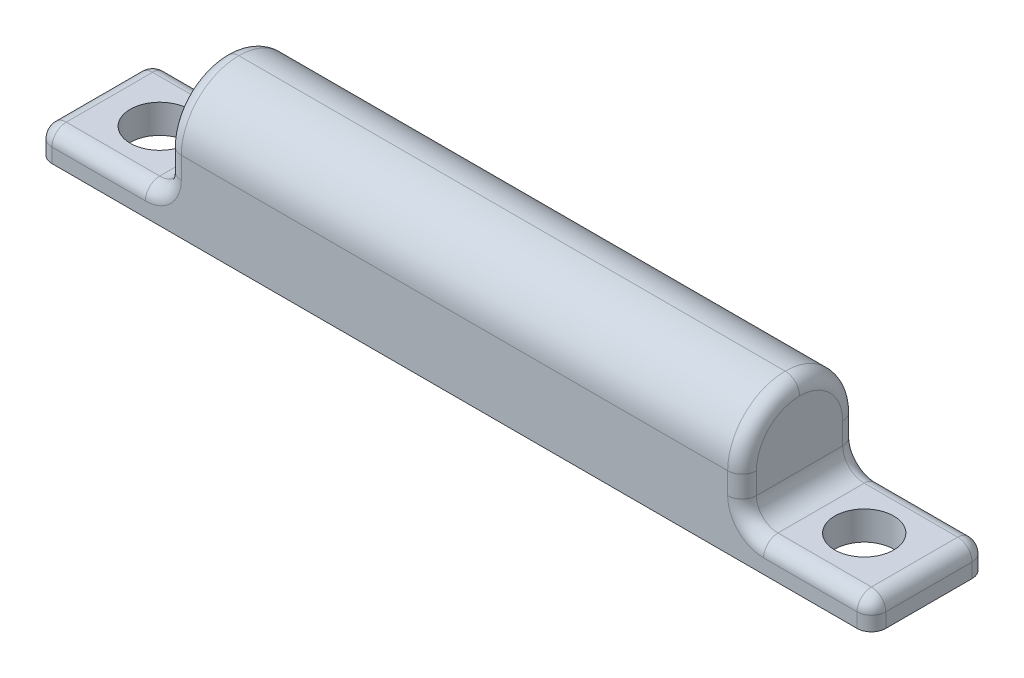
ISO-10303-21;
HEADER;
FILE_DESCRIPTION(('STEP AP214'),'2;1');
FILE_NAME('part.step','',(''),(''),'','','');
FILE_SCHEMA(('AUTOMOTIVE_DESIGN { 1 0 10303 214 1 1 1 1 }'));
ENDSEC;
DATA;
#1=APPLICATION_CONTEXT('core data for automotive mechanical design processes');
#2=APPLICATION_PROTOCOL_DEFINITION('international standard','automotive_design',2000,#1);
#3=PRODUCT_CONTEXT('',#1,'mechanical');
#4=PRODUCT('Part','Part','',(#3));
#5=PRODUCT_RELATED_PRODUCT_CATEGORY('part','',(#4));
#6=PRODUCT_DEFINITION_FORMATION('','',#4);
#7=PRODUCT_DEFINITION_CONTEXT('part definition',#1,'design');
#8=PRODUCT_DEFINITION('design','',#6,#7);
#9=PRODUCT_DEFINITION_SHAPE('','',#8);
#10=(LENGTH_UNIT() NAMED_UNIT(*) SI_UNIT(.MILLI.,.METRE.));
#11=(NAMED_UNIT(*) PLANE_ANGLE_UNIT() SI_UNIT($,.RADIAN.));
#12=(NAMED_UNIT(*) SI_UNIT($,.STERADIAN.) SOLID_ANGLE_UNIT());
#13=UNCERTAINTY_MEASURE_WITH_UNIT(LENGTH_MEASURE(1.E-05),#10,'distance_accuracy_value','');
#14=(GEOMETRIC_REPRESENTATION_CONTEXT(3) GLOBAL_UNCERTAINTY_ASSIGNED_CONTEXT((#13)) GLOBAL_UNIT_ASSIGNED_CONTEXT((#10,
#11,#12)) REPRESENTATION_CONTEXT('',''));
#15=CARTESIAN_POINT('',(0.,0.,0.));
#16=DIRECTION('',(0.,0.,1.));
#17=DIRECTION('',(1.,0.,0.));
#18=AXIS2_PLACEMENT_3D('',#15,#16,#17);
#19=CARTESIAN_POINT('',(0.,2.,0.));
#20=DIRECTION('',(0.,1.,0.));
#21=DIRECTION('',(0.,0.,1.));
#22=AXIS2_PLACEMENT_3D('',#19,#20,#21);
#23=PLANE('',#22);
#24=CARTESIAN_POINT('',(4.5,2.,4.));
#25=DIRECTION('',(0.,1.,0.));
#26=DIRECTION('',(0.,0.,1.));
#27=AXIS2_PLACEMENT_3D('',#24,#25,#26);
#28=CIRCLE('',#27,2.05);
#29=CARTESIAN_POINT('',(4.5,2.,6.05));
#30=VERTEX_POINT('',#29);
#31=EDGE_CURVE('E548',#30,#30,#28,.T.);
#32=ORIENTED_EDGE('',*,*,#31,.F.);
#33=EDGE_LOOP('',(#32));
#34=FACE_BOUND('',#33,.T.);
#35=DIRECTION('',(0.,0.,1.));
#36=VECTOR('',#35,1.);
#37=CARTESIAN_POINT('',(1.,2.,7.));
#38=LINE('',#37,#36);
#39=CARTESIAN_POINT('',(1.,2.,1.));
#40=VERTEX_POINT('',#39);
#41=CARTESIAN_POINT('',(1.,2.,7.));
#42=VERTEX_POINT('',#41);
#43=EDGE_CURVE('E395',#40,#42,#38,.T.);
#44=ORIENTED_EDGE('',*,*,#43,.T.);
#45=DIRECTION('',(1.,0.,0.));
#46=VECTOR('',#45,1.);
#47=CARTESIAN_POINT('',(7.5,2.,7.));
#48=LINE('',#47,#46);
#49=CARTESIAN_POINT('',(7.5,2.,7.));
#50=VERTEX_POINT('',#49);
#51=EDGE_CURVE('E398',#42,#50,#48,.T.);
#52=ORIENTED_EDGE('',*,*,#51,.T.);
#53=DIRECTION('',(0.,0.,-1.));
#54=VECTOR('',#53,1.);
#55=CARTESIAN_POINT('',(7.5,2.,0.));
#56=LINE('',#55,#54);
#57=CARTESIAN_POINT('',(7.5,2.,1.));
#58=VERTEX_POINT('',#57);
#59=EDGE_CURVE('E284',#50,#58,#56,.T.);
#60=ORIENTED_EDGE('',*,*,#59,.T.);
#61=DIRECTION('',(1.,0.,0.));
#62=VECTOR('',#61,1.);
#63=CARTESIAN_POINT('',(0.,2.,1.));
#64=LINE('',#63,#62);
#65=EDGE_CURVE('E392',#58,#40,#64,.F.);
#66=ORIENTED_EDGE('',*,*,#65,.T.);
#67=EDGE_LOOP('',(#44,#52,#60,#66));
#68=FACE_BOUND('',#67,.T.);
#69=ADVANCED_FACE('F43',(#34,#68),#23,.T.);
#70=CARTESIAN_POINT('',(0.,2.,8.));
#71=DIRECTION('',(0.,0.,-1.));
#72=DIRECTION('',(-1.,0.,0.));
#73=AXIS2_PLACEMENT_3D('',#70,#71,#72);
#74=PLANE('',#73);
#75=DIRECTION('',(0.,-1.,0.));
#76=VECTOR('',#75,1.);
#77=CARTESIAN_POINT('',(57.,2.,8.));
#78=LINE('',#77,#76);
#79=CARTESIAN_POINT('',(57.,0.,8.));
#80=VERTEX_POINT('',#79);
#81=CARTESIAN_POINT('',(57.,1.,8.));
#82=VERTEX_POINT('',#81);
#83=EDGE_CURVE('E266',#80,#82,#78,.F.);
#84=ORIENTED_EDGE('',*,*,#83,.T.);
#85=DIRECTION('',(1.,0.,0.));
#86=VECTOR('',#85,1.);
#87=CARTESIAN_POINT('',(50.5,1.,8.));
#88=LINE('',#87,#86);
#89=CARTESIAN_POINT('',(50.5,1.,8.));
#90=VERTEX_POINT('',#89);
#91=EDGE_CURVE('E370',#82,#90,#88,.F.);
#92=ORIENTED_EDGE('',*,*,#91,.T.);
#93=CARTESIAN_POINT('',(50.5,3.5,8.));
#94=DIRECTION('',(0.,0.,-1.));
#95=DIRECTION('',(-1.,0.,0.));
#96=AXIS2_PLACEMENT_3D('',#93,#94,#95);
#97=CIRCLE('',#96,2.5);
#98=CARTESIAN_POINT('',(48.,3.5,8.));
#99=VERTEX_POINT('',#98);
#100=EDGE_CURVE('E367',#90,#99,#97,.T.);
#101=ORIENTED_EDGE('',*,*,#100,.T.);
#102=DIRECTION('',(0.,-1.,0.));
#103=VECTOR('',#102,1.);
#104=CARTESIAN_POINT('',(48.,5.,8.));
#105=LINE('',#104,#103);
#106=CARTESIAN_POINT('',(48.,5.,8.));
#107=VERTEX_POINT('',#106);
#108=EDGE_CURVE('E364',#99,#107,#105,.F.);
#109=ORIENTED_EDGE('',*,*,#108,.T.);
#110=DIRECTION('',(1.,0.,0.));
#111=VECTOR('',#110,1.);
#112=CARTESIAN_POINT('',(9.,5.,8.));
#113=LINE('',#112,#111);
#114=CARTESIAN_POINT('',(10.,5.,8.));
#115=VERTEX_POINT('',#114);
#116=EDGE_CURVE('E238',#107,#115,#113,.F.);
#117=ORIENTED_EDGE('',*,*,#116,.T.);
#118=DIRECTION('',(0.,-1.,0.));
#119=VECTOR('',#118,1.);
#120=CARTESIAN_POINT('',(10.,2.,8.));
#121=LINE('',#120,#119);
#122=CARTESIAN_POINT('',(10.,3.5,8.));
#123=VERTEX_POINT('',#122);
#124=EDGE_CURVE('E360',#115,#123,#121,.T.);
#125=ORIENTED_EDGE('',*,*,#124,.T.);
#126=CARTESIAN_POINT('',(7.5,3.5,8.));
#127=DIRECTION('',(0.,0.,-1.));
#128=DIRECTION('',(-1.,0.,0.));
#129=AXIS2_PLACEMENT_3D('',#126,#127,#128);
#130=CIRCLE('',#129,2.5);
#131=CARTESIAN_POINT('',(7.5,1.,8.));
#132=VERTEX_POINT('',#131);
#133=EDGE_CURVE('E357',#123,#132,#130,.T.);
#134=ORIENTED_EDGE('',*,*,#133,.T.);
#135=DIRECTION('',(1.,0.,0.));
#136=VECTOR('',#135,1.);
#137=CARTESIAN_POINT('',(1.,1.,8.));
#138=LINE('',#137,#136);
#139=CARTESIAN_POINT('',(1.,1.,8.));
#140=VERTEX_POINT('',#139);
#141=EDGE_CURVE('E354',#132,#140,#138,.F.);
#142=ORIENTED_EDGE('',*,*,#141,.T.);
#143=DIRECTION('',(0.,-1.,0.));
#144=VECTOR('',#143,1.);
#145=CARTESIAN_POINT('',(1.,2.,8.));
#146=LINE('',#145,#144);
#147=CARTESIAN_POINT('',(1.,0.,8.));
#148=VERTEX_POINT('',#147);
#149=EDGE_CURVE('E263',#140,#148,#146,.T.);
#150=ORIENTED_EDGE('',*,*,#149,.T.);
#151=DIRECTION('',(1.,0.,0.));
#152=VECTOR('',#151,1.);
#153=CARTESIAN_POINT('',(0.,0.,8.));
#154=LINE('',#153,#152);
#155=EDGE_CURVE('E524',#148,#80,#154,.T.);
#156=ORIENTED_EDGE('',*,*,#155,.T.);
#157=EDGE_LOOP('',(#84,#92,#101,#109,#117,#125,#134,#142,#150,#156));
#158=FACE_BOUND('',#157,.T.);
#159=ADVANCED_FACE('F563',(#158),#74,.F.);
#160=CARTESIAN_POINT('',(58.,2.,0.));
#161=DIRECTION('',(1.,0.,0.));
#162=DIRECTION('',(0.,0.,-1.));
#163=AXIS2_PLACEMENT_3D('',#160,#161,#162);
#164=PLANE('',#163);
#165=DIRECTION('',(0.,-1.,0.));
#166=VECTOR('',#165,1.);
#167=CARTESIAN_POINT('',(58.,2.,1.));
#168=LINE('',#167,#166);
#169=CARTESIAN_POINT('',(58.,0.,1.));
#170=VERTEX_POINT('',#169);
#171=CARTESIAN_POINT('',(58.,1.,1.));
#172=VERTEX_POINT('',#171);
#173=EDGE_CURVE('E259',#170,#172,#168,.F.);
#174=ORIENTED_EDGE('',*,*,#173,.T.);
#175=DIRECTION('',(0.,0.,1.));
#176=VECTOR('',#175,1.);
#177=CARTESIAN_POINT('',(58.,1.,0.));
#178=LINE('',#177,#176);
#179=CARTESIAN_POINT('',(58.,1.,7.));
#180=VERTEX_POINT('',#179);
#181=EDGE_CURVE('E348',#172,#180,#178,.T.);
#182=ORIENTED_EDGE('',*,*,#181,.T.);
#183=DIRECTION('',(0.,-1.,0.));
#184=VECTOR('',#183,1.);
#185=CARTESIAN_POINT('',(58.,0.,7.));
#186=LINE('',#185,#184);
#187=CARTESIAN_POINT('',(58.,0.,7.));
#188=VERTEX_POINT('',#187);
#189=EDGE_CURVE('E256',#180,#188,#186,.T.);
#190=ORIENTED_EDGE('',*,*,#189,.T.);
#191=DIRECTION('',(0.,0.,1.));
#192=VECTOR('',#191,1.);
#193=CARTESIAN_POINT('',(58.,0.,0.));
#194=LINE('',#193,#192);
#195=EDGE_CURVE('E232',#170,#188,#194,.T.);
#196=ORIENTED_EDGE('',*,*,#195,.F.);
#197=EDGE_LOOP('',(#174,#182,#190,#196));
#198=FACE_BOUND('',#197,.T.);
#199=ADVANCED_FACE('F917',(#198),#164,.T.);
#200=CARTESIAN_POINT('',(0.,2.,0.));
#201=DIRECTION('',(0.,0.,-1.));
#202=DIRECTION('',(-1.,0.,0.));
#203=AXIS2_PLACEMENT_3D('',#200,#201,#202);
#204=PLANE('',#203);
#205=DIRECTION('',(1.,0.,0.));
#206=VECTOR('',#205,1.);
#207=CARTESIAN_POINT('',(0.,5.,0.));
#208=LINE('',#207,#206);
#209=CARTESIAN_POINT('',(10.,5.,0.));
#210=VERTEX_POINT('',#209);
#211=CARTESIAN_POINT('',(48.,5.,0.));
#212=VERTEX_POINT('',#211);
#213=EDGE_CURVE('E244',#210,#212,#208,.T.);
#214=ORIENTED_EDGE('',*,*,#213,.T.);
#215=DIRECTION('',(0.,-1.,0.));
#216=VECTOR('',#215,1.);
#217=CARTESIAN_POINT('',(48.,2.,0.));
#218=LINE('',#217,#216);
#219=CARTESIAN_POINT('',(48.,3.5,0.));
#220=VERTEX_POINT('',#219);
#221=EDGE_CURVE('E327',#212,#220,#218,.T.);
#222=ORIENTED_EDGE('',*,*,#221,.T.);
#223=CARTESIAN_POINT('',(50.5,3.5,0.));
#224=DIRECTION('',(0.,0.,-1.));
#225=DIRECTION('',(-1.,0.,0.));
#226=AXIS2_PLACEMENT_3D('',#223,#224,#225);
#227=CIRCLE('',#226,2.5);
#228=CARTESIAN_POINT('',(50.5,1.,0.));
#229=VERTEX_POINT('',#228);
#230=EDGE_CURVE('E324',#220,#229,#227,.F.);
#231=ORIENTED_EDGE('',*,*,#230,.T.);
#232=DIRECTION('',(1.,0.,0.));
#233=VECTOR('',#232,1.);
#234=CARTESIAN_POINT('',(0.,1.,0.));
#235=LINE('',#234,#233);
#236=CARTESIAN_POINT('',(57.,1.,0.));
#237=VERTEX_POINT('',#236);
#238=EDGE_CURVE('E321',#229,#237,#235,.T.);
#239=ORIENTED_EDGE('',*,*,#238,.T.);
#240=DIRECTION('',(0.,-1.,0.));
#241=VECTOR('',#240,1.);
#242=CARTESIAN_POINT('',(57.,2.,0.));
#243=LINE('',#242,#241);
#244=CARTESIAN_POINT('',(57.,0.,0.));
#245=VERTEX_POINT('',#244);
#246=EDGE_CURVE('E229',#237,#245,#243,.T.);
#247=ORIENTED_EDGE('',*,*,#246,.T.);
#248=DIRECTION('',(1.,0.,0.));
#249=VECTOR('',#248,1.);
#250=CARTESIAN_POINT('',(0.,0.,0.));
#251=LINE('',#250,#249);
#252=CARTESIAN_POINT('',(1.,0.,0.));
#253=VERTEX_POINT('',#252);
#254=EDGE_CURVE('E213',#253,#245,#251,.T.);
#255=ORIENTED_EDGE('',*,*,#254,.F.);
#256=DIRECTION('',(0.,-1.,0.));
#257=VECTOR('',#256,1.);
#258=CARTESIAN_POINT('',(1.,2.,0.));
#259=LINE('',#258,#257);
#260=CARTESIAN_POINT('',(1.,1.,0.));
#261=VERTEX_POINT('',#260);
#262=EDGE_CURVE('E226',#253,#261,#259,.F.);
#263=ORIENTED_EDGE('',*,*,#262,.T.);
#264=DIRECTION('',(1.,0.,0.));
#265=VECTOR('',#264,1.);
#266=CARTESIAN_POINT('',(0.,1.,0.));
#267=LINE('',#266,#265);
#268=CARTESIAN_POINT('',(7.5,1.,0.));
#269=VERTEX_POINT('',#268);
#270=EDGE_CURVE('E318',#261,#269,#267,.T.);
#271=ORIENTED_EDGE('',*,*,#270,.T.);
#272=CARTESIAN_POINT('',(7.5,3.5,0.));
#273=DIRECTION('',(0.,0.,-1.));
#274=DIRECTION('',(-1.,0.,0.));
#275=AXIS2_PLACEMENT_3D('',#272,#273,#274);
#276=CIRCLE('',#275,2.5);
#277=CARTESIAN_POINT('',(10.,3.5,0.));
#278=VERTEX_POINT('',#277);
#279=EDGE_CURVE('E315',#269,#278,#276,.F.);
#280=ORIENTED_EDGE('',*,*,#279,.T.);
#281=DIRECTION('',(0.,-1.,0.));
#282=VECTOR('',#281,1.);
#283=CARTESIAN_POINT('',(10.,5.,0.));
#284=LINE('',#283,#282);
#285=EDGE_CURVE('E312',#278,#210,#284,.F.);
#286=ORIENTED_EDGE('',*,*,#285,.T.);
#287=EDGE_LOOP('',(#214,#222,#231,#239,#247,#255,#263,#271,#280,#286));
#288=FACE_BOUND('',#287,.T.);
#289=ADVANCED_FACE('F225',(#288),#204,.T.);
#290=CARTESIAN_POINT('',(4.5,2.,4.));
#291=DIRECTION('',(0.,-1.,0.));
#292=DIRECTION('',(0.,0.,-1.));
#293=AXIS2_PLACEMENT_3D('',#290,#291,#292);
#294=CYLINDRICAL_SURFACE('',#293,2.05);
#295=ORIENTED_EDGE('',*,*,#31,.T.);
#296=EDGE_LOOP('',(#295));
#297=FACE_BOUND('',#296,.T.);
#298=CARTESIAN_POINT('',(4.5,0.,4.));
#299=DIRECTION('',(0.,1.,0.));
#300=DIRECTION('',(0.,0.,1.));
#301=AXIS2_PLACEMENT_3D('',#298,#299,#300);
#302=CIRCLE('',#301,2.05);
#303=CARTESIAN_POINT('',(4.5,0.,6.05));
#304=VERTEX_POINT('',#303);
#305=EDGE_CURVE('E540',#304,#304,#302,.T.);
#306=ORIENTED_EDGE('',*,*,#305,.F.);
#307=EDGE_LOOP('',(#306));
#308=FACE_BOUND('',#307,.T.);
#309=ADVANCED_FACE('F558',(#297,#308),#294,.F.);
#310=CARTESIAN_POINT('',(0.,2.,0.));
#311=DIRECTION('',(1.,0.,0.));
#312=DIRECTION('',(0.,0.,-1.));
#313=AXIS2_PLACEMENT_3D('',#310,#311,#312);
#314=PLANE('',#313);
#315=DIRECTION('',(0.,-1.,0.));
#316=VECTOR('',#315,1.);
#317=CARTESIAN_POINT('',(0.,2.,7.));
#318=LINE('',#317,#316);
#319=CARTESIAN_POINT('',(0.,0.,7.));
#320=VERTEX_POINT('',#319);
#321=CARTESIAN_POINT('',(0.,1.,7.));
#322=VERTEX_POINT('',#321);
#323=EDGE_CURVE('E270',#320,#322,#318,.F.);
#324=ORIENTED_EDGE('',*,*,#323,.T.);
#325=DIRECTION('',(0.,0.,1.));
#326=VECTOR('',#325,1.);
#327=CARTESIAN_POINT('',(0.,1.,1.));
#328=LINE('',#327,#326);
#329=CARTESIAN_POINT('',(0.,1.,1.));
#330=VERTEX_POINT('',#329);
#331=EDGE_CURVE('E61',#322,#330,#328,.F.);
#332=ORIENTED_EDGE('',*,*,#331,.T.);
#333=DIRECTION('',(0.,-1.,0.));
#334=VECTOR('',#333,1.);
#335=CARTESIAN_POINT('',(0.,0.,1.));
#336=LINE('',#335,#334);
#337=CARTESIAN_POINT('',(0.,0.,1.));
#338=VERTEX_POINT('',#337);
#339=EDGE_CURVE('E273',#330,#338,#336,.T.);
#340=ORIENTED_EDGE('',*,*,#339,.T.);
#341=DIRECTION('',(0.,0.,1.));
#342=VECTOR('',#341,1.);
#343=CARTESIAN_POINT('',(0.,0.,0.));
#344=LINE('',#343,#342);
#345=EDGE_CURVE('E215',#338,#320,#344,.T.);
#346=ORIENTED_EDGE('',*,*,#345,.T.);
#347=EDGE_LOOP('',(#324,#332,#340,#346));
#348=FACE_BOUND('',#347,.T.);
#349=ADVANCED_FACE('F902',(#348),#314,.F.);
#350=CARTESIAN_POINT('',(53.5,2.,4.));
#351=DIRECTION('',(0.,-1.,0.));
#352=DIRECTION('',(0.,0.,-1.));
#353=AXIS2_PLACEMENT_3D('',#350,#351,#352);
#354=CYLINDRICAL_SURFACE('',#353,2.05);
#355=CARTESIAN_POINT('',(53.5,2.,4.));
#356=DIRECTION('',(0.,1.,0.));
#357=DIRECTION('',(0.,0.,1.));
#358=AXIS2_PLACEMENT_3D('',#355,#356,#357);
#359=CIRCLE('',#358,2.05);
#360=CARTESIAN_POINT('',(53.5,2.,6.05));
#361=VERTEX_POINT('',#360);
#362=EDGE_CURVE('E535',#361,#361,#359,.T.);
#363=ORIENTED_EDGE('',*,*,#362,.T.);
#364=EDGE_LOOP('',(#363));
#365=FACE_BOUND('',#364,.T.);
#366=CARTESIAN_POINT('',(53.5,0.,4.));
#367=DIRECTION('',(0.,1.,0.));
#368=DIRECTION('',(0.,0.,1.));
#369=AXIS2_PLACEMENT_3D('',#366,#367,#368);
#370=CIRCLE('',#369,2.05);
#371=CARTESIAN_POINT('',(53.5,0.,6.05));
#372=VERTEX_POINT('',#371);
#373=EDGE_CURVE('E544',#372,#372,#370,.T.);
#374=ORIENTED_EDGE('',*,*,#373,.F.);
#375=EDGE_LOOP('',(#374));
#376=FACE_BOUND('',#375,.T.);
#377=ADVANCED_FACE('F894',(#365,#376),#354,.F.);
#378=DIRECTION('',(0.,0.,1.));
#379=VECTOR('',#378,1.);
#380=CARTESIAN_POINT('',(57.,2.,0.));
#381=LINE('',#380,#379);
#382=CARTESIAN_POINT('',(57.,2.,7.));
#383=VERTEX_POINT('',#382);
#384=CARTESIAN_POINT('',(57.,2.,1.));
#385=VERTEX_POINT('',#384);
#386=EDGE_CURVE('E339',#383,#385,#381,.F.);
#387=ORIENTED_EDGE('',*,*,#386,.T.);
#388=DIRECTION('',(1.,0.,0.));
#389=VECTOR('',#388,1.);
#390=CARTESIAN_POINT('',(0.,2.,1.));
#391=LINE('',#390,#389);
#392=CARTESIAN_POINT('',(50.5,2.,1.));
#393=VERTEX_POINT('',#392);
#394=EDGE_CURVE('E342',#385,#393,#391,.F.);
#395=ORIENTED_EDGE('',*,*,#394,.T.);
#396=DIRECTION('',(0.,0.,-1.));
#397=VECTOR('',#396,1.);
#398=CARTESIAN_POINT('',(50.5,2.,8.));
#399=LINE('',#398,#397);
#400=CARTESIAN_POINT('',(50.5,2.,7.));
#401=VERTEX_POINT('',#400);
#402=EDGE_CURVE('E280',#393,#401,#399,.F.);
#403=ORIENTED_EDGE('',*,*,#402,.T.);
#404=DIRECTION('',(1.,0.,0.));
#405=VECTOR('',#404,1.);
#406=CARTESIAN_POINT('',(57.,2.,7.));
#407=LINE('',#406,#405);
#408=EDGE_CURVE('E336',#401,#383,#407,.T.);
#409=ORIENTED_EDGE('',*,*,#408,.T.);
#410=EDGE_LOOP('',(#387,#395,#403,#409));
#411=FACE_BOUND('',#410,.T.);
#412=ORIENTED_EDGE('',*,*,#362,.F.);
#413=EDGE_LOOP('',(#412));
#414=FACE_BOUND('',#413,.T.);
#415=ADVANCED_FACE('F565',(#411,#414),#23,.T.);
#416=CARTESIAN_POINT('',(0.,0.,0.));
#417=DIRECTION('',(0.,1.,0.));
#418=DIRECTION('',(0.,0.,1.));
#419=AXIS2_PLACEMENT_3D('',#416,#417,#418);
#420=PLANE('',#419);
#421=ORIENTED_EDGE('',*,*,#254,.T.);
#422=CARTESIAN_POINT('',(57.,0.,1.));
#423=DIRECTION('',(0.,1.,0.));
#424=DIRECTION('',(0.,0.,1.));
#425=AXIS2_PLACEMENT_3D('',#422,#423,#424);
#426=CIRCLE('',#425,1.);
#427=EDGE_CURVE('E253',#245,#170,#426,.F.);
#428=ORIENTED_EDGE('',*,*,#427,.T.);
#429=ORIENTED_EDGE('',*,*,#195,.T.);
#430=CARTESIAN_POINT('',(57.,0.,7.));
#431=DIRECTION('',(0.,1.,0.));
#432=DIRECTION('',(0.,0.,1.));
#433=AXIS2_PLACEMENT_3D('',#430,#431,#432);
#434=CIRCLE('',#433,1.);
#435=EDGE_CURVE('E219',#188,#80,#434,.F.);
#436=ORIENTED_EDGE('',*,*,#435,.T.);
#437=ORIENTED_EDGE('',*,*,#155,.F.);
#438=CARTESIAN_POINT('',(1.,0.,7.));
#439=DIRECTION('',(0.,1.,0.));
#440=DIRECTION('',(0.,0.,1.));
#441=AXIS2_PLACEMENT_3D('',#438,#439,#440);
#442=CIRCLE('',#441,1.);
#443=EDGE_CURVE('E220',#148,#320,#442,.F.);
#444=ORIENTED_EDGE('',*,*,#443,.T.);
#445=ORIENTED_EDGE('',*,*,#345,.F.);
#446=CARTESIAN_POINT('',(1.,0.,1.));
#447=DIRECTION('',(0.,1.,0.));
#448=DIRECTION('',(0.,0.,1.));
#449=AXIS2_PLACEMENT_3D('',#446,#447,#448);
#450=CIRCLE('',#449,1.);
#451=EDGE_CURVE('E209',#338,#253,#450,.F.);
#452=ORIENTED_EDGE('',*,*,#451,.T.);
#453=EDGE_LOOP('',(#421,#428,#429,#436,#437,#444,#445,#452));
#454=FACE_BOUND('',#453,.T.);
#455=ORIENTED_EDGE('',*,*,#373,.T.);
#456=EDGE_LOOP('',(#455));
#457=FACE_BOUND('',#456,.T.);
#458=ORIENTED_EDGE('',*,*,#305,.T.);
#459=EDGE_LOOP('',(#458));
#460=FACE_BOUND('',#459,.T.);
#461=ADVANCED_FACE('F211',(#454,#457,#460),#420,.F.);
#462=CARTESIAN_POINT('',(49.,9.,0.));
#463=DIRECTION('',(1.,0.,0.));
#464=DIRECTION('',(0.,0.,-1.));
#465=AXIS2_PLACEMENT_3D('',#462,#463,#464);
#466=PLANE('',#465);
#467=DIRECTION('',(0.,0.,-1.));
#468=VECTOR('',#467,1.);
#469=CARTESIAN_POINT('',(49.,3.5,0.));
#470=LINE('',#469,#468);
#471=CARTESIAN_POINT('',(49.,3.5,7.));
#472=VERTEX_POINT('',#471);
#473=CARTESIAN_POINT('',(49.,3.5,1.));
#474=VERTEX_POINT('',#473);
#475=EDGE_CURVE('E276',#472,#474,#470,.T.);
#476=ORIENTED_EDGE('',*,*,#475,.T.);
#477=DIRECTION('',(0.,-1.,0.));
#478=VECTOR('',#477,1.);
#479=CARTESIAN_POINT('',(49.,9.,1.));
#480=LINE('',#479,#478);
#481=CARTESIAN_POINT('',(49.,5.,1.));
#482=VERTEX_POINT('',#481);
#483=EDGE_CURVE('E302',#474,#482,#480,.F.);
#484=ORIENTED_EDGE('',*,*,#483,.T.);
#485=CARTESIAN_POINT('',(49.,5.,4.));
#486=DIRECTION('',(1.,0.,0.));
#487=DIRECTION('',(0.,0.,-1.));
#488=AXIS2_PLACEMENT_3D('',#485,#486,#487);
#489=CIRCLE('',#488,3.);
#490=CARTESIAN_POINT('',(49.,8.,4.));
#491=VERTEX_POINT('',#490);
#492=EDGE_CURVE('E298',#482,#491,#489,.T.);
#493=ORIENTED_EDGE('',*,*,#492,.T.);
#494=CARTESIAN_POINT('',(49.,5.,4.));
#495=DIRECTION('',(1.,0.,0.));
#496=DIRECTION('',(0.,0.,-1.));
#497=AXIS2_PLACEMENT_3D('',#494,#495,#496);
#498=CIRCLE('',#497,3.);
#499=CARTESIAN_POINT('',(49.,5.,7.));
#500=VERTEX_POINT('',#499);
#501=EDGE_CURVE('E292',#491,#500,#498,.T.);
#502=ORIENTED_EDGE('',*,*,#501,.T.);
#503=DIRECTION('',(0.,-1.,0.));
#504=VECTOR('',#503,1.);
#505=CARTESIAN_POINT('',(49.,3.5,7.));
#506=LINE('',#505,#504);
#507=EDGE_CURVE('E295',#500,#472,#506,.T.);
#508=ORIENTED_EDGE('',*,*,#507,.T.);
#509=EDGE_LOOP('',(#476,#484,#493,#502,#508));
#510=FACE_BOUND('',#509,.T.);
#511=ADVANCED_FACE('F874',(#510),#466,.T.);
#512=CARTESIAN_POINT('',(9.,9.,0.));
#513=DIRECTION('',(1.,0.,0.));
#514=DIRECTION('',(0.,0.,-1.));
#515=AXIS2_PLACEMENT_3D('',#512,#513,#514);
#516=PLANE('',#515);
#517=DIRECTION('',(0.,0.,-1.));
#518=VECTOR('',#517,1.);
#519=CARTESIAN_POINT('',(9.,3.5,0.));
#520=LINE('',#519,#518);
#521=CARTESIAN_POINT('',(9.,3.5,1.));
#522=VERTEX_POINT('',#521);
#523=CARTESIAN_POINT('',(9.,3.5,7.));
#524=VERTEX_POINT('',#523);
#525=EDGE_CURVE('E288',#522,#524,#520,.F.);
#526=ORIENTED_EDGE('',*,*,#525,.T.);
#527=DIRECTION('',(0.,-1.,0.));
#528=VECTOR('',#527,1.);
#529=CARTESIAN_POINT('',(9.,9.,7.));
#530=LINE('',#529,#528);
#531=CARTESIAN_POINT('',(9.,5.,7.));
#532=VERTEX_POINT('',#531);
#533=EDGE_CURVE('E382',#524,#532,#530,.F.);
#534=ORIENTED_EDGE('',*,*,#533,.T.);
#535=CARTESIAN_POINT('',(9.,5.,4.));
#536=DIRECTION('',(1.,0.,0.));
#537=DIRECTION('',(0.,0.,-1.));
#538=AXIS2_PLACEMENT_3D('',#535,#536,#537);
#539=CIRCLE('',#538,3.);
#540=CARTESIAN_POINT('',(9.,8.,4.));
#541=VERTEX_POINT('',#540);
#542=EDGE_CURVE('E373',#532,#541,#539,.F.);
#543=ORIENTED_EDGE('',*,*,#542,.T.);
#544=CARTESIAN_POINT('',(9.,5.,4.));
#545=DIRECTION('',(1.,0.,0.));
#546=DIRECTION('',(0.,0.,-1.));
#547=AXIS2_PLACEMENT_3D('',#544,#545,#546);
#548=CIRCLE('',#547,3.);
#549=CARTESIAN_POINT('',(9.,5.,1.));
#550=VERTEX_POINT('',#549);
#551=EDGE_CURVE('E376',#541,#550,#548,.F.);
#552=ORIENTED_EDGE('',*,*,#551,.T.);
#553=DIRECTION('',(0.,-1.,0.));
#554=VECTOR('',#553,1.);
#555=CARTESIAN_POINT('',(9.,3.5,1.));
#556=LINE('',#555,#554);
#557=EDGE_CURVE('E379',#550,#522,#556,.T.);
#558=ORIENTED_EDGE('',*,*,#557,.T.);
#559=EDGE_LOOP('',(#526,#534,#543,#552,#558));
#560=FACE_BOUND('',#559,.T.);
#561=ADVANCED_FACE('F588',(#560),#516,.F.);
#562=CARTESIAN_POINT('',(0.,5.,4.));
#563=DIRECTION('',(-1.,0.,0.));
#564=DIRECTION('',(0.,0.,1.));
#565=AXIS2_PLACEMENT_3D('',#562,#563,#564);
#566=CYLINDRICAL_SURFACE('',#565,4.);
#567=ORIENTED_EDGE('',*,*,#116,.F.);
#568=CARTESIAN_POINT('',(48.,5.,4.));
#569=DIRECTION('',(1.,0.,0.));
#570=DIRECTION('',(0.,0.,-1.));
#571=AXIS2_PLACEMENT_3D('',#568,#569,#570);
#572=CIRCLE('',#571,4.);
#573=CARTESIAN_POINT('',(48.,9.,4.));
#574=VERTEX_POINT('',#573);
#575=EDGE_CURVE('E11',#107,#574,#572,.F.);
#576=ORIENTED_EDGE('',*,*,#575,.T.);
#577=DIRECTION('',(1.,0.,0.));
#578=VECTOR('',#577,1.);
#579=CARTESIAN_POINT('',(49.,9.,4.));
#580=LINE('',#579,#578);
#581=CARTESIAN_POINT('',(10.,9.,4.));
#582=VERTEX_POINT('',#581);
#583=EDGE_CURVE('E247',#582,#574,#580,.T.);
#584=ORIENTED_EDGE('',*,*,#583,.F.);
#585=CARTESIAN_POINT('',(10.,5.,4.));
#586=DIRECTION('',(1.,0.,0.));
#587=DIRECTION('',(0.,0.,-1.));
#588=AXIS2_PLACEMENT_3D('',#585,#586,#587);
#589=CIRCLE('',#588,4.);
#590=EDGE_CURVE('E53',#582,#115,#589,.T.);
#591=ORIENTED_EDGE('',*,*,#590,.T.);
#592=EDGE_LOOP('',(#567,#576,#584,#591));
#593=FACE_BOUND('',#592,.T.);
#594=ADVANCED_FACE('F521',(#593),#566,.T.);
#595=CARTESIAN_POINT('',(0.,5.,4.));
#596=DIRECTION('',(1.,0.,0.));
#597=DIRECTION('',(0.,0.,-1.));
#598=AXIS2_PLACEMENT_3D('',#595,#596,#597);
#599=CYLINDRICAL_SURFACE('',#598,4.);
#600=ORIENTED_EDGE('',*,*,#583,.T.);
#601=CARTESIAN_POINT('',(48.,5.,4.));
#602=DIRECTION('',(1.,0.,0.));
#603=DIRECTION('',(0.,0.,-1.));
#604=AXIS2_PLACEMENT_3D('',#601,#602,#603);
#605=CIRCLE('',#604,4.);
#606=EDGE_CURVE('E308',#574,#212,#605,.F.);
#607=ORIENTED_EDGE('',*,*,#606,.T.);
#608=ORIENTED_EDGE('',*,*,#213,.F.);
#609=CARTESIAN_POINT('',(10.,5.,4.));
#610=DIRECTION('',(1.,0.,0.));
#611=DIRECTION('',(0.,0.,-1.));
#612=AXIS2_PLACEMENT_3D('',#609,#610,#611);
#613=CIRCLE('',#612,4.);
#614=EDGE_CURVE('E305',#210,#582,#613,.T.);
#615=ORIENTED_EDGE('',*,*,#614,.T.);
#616=EDGE_LOOP('',(#600,#607,#608,#615));
#617=FACE_BOUND('',#616,.T.);
#618=ADVANCED_FACE('F517',(#617),#599,.T.);
#619=CARTESIAN_POINT('',(57.,2.,1.));
#620=DIRECTION('',(0.,-1.,0.));
#621=DIRECTION('',(0.,0.,-1.));
#622=AXIS2_PLACEMENT_3D('',#619,#620,#621);
#623=CYLINDRICAL_SURFACE('',#622,1.);
#624=ORIENTED_EDGE('',*,*,#246,.F.);
#625=CARTESIAN_POINT('',(57.,1.,1.));
#626=DIRECTION('',(0.,-1.,0.));
#627=DIRECTION('',(0.,0.,-1.));
#628=AXIS2_PLACEMENT_3D('',#625,#626,#627);
#629=CIRCLE('',#628,1.);
#630=EDGE_CURVE('E345',#237,#172,#629,.T.);
#631=ORIENTED_EDGE('',*,*,#630,.T.);
#632=ORIENTED_EDGE('',*,*,#173,.F.);
#633=ORIENTED_EDGE('',*,*,#427,.F.);
#634=EDGE_LOOP('',(#624,#631,#632,#633));
#635=FACE_BOUND('',#634,.T.);
#636=ADVANCED_FACE('F839',(#635),#623,.T.);
#637=CARTESIAN_POINT('',(57.,2.,7.));
#638=DIRECTION('',(0.,1.,0.));
#639=DIRECTION('',(0.,0.,1.));
#640=AXIS2_PLACEMENT_3D('',#637,#638,#639);
#641=CYLINDRICAL_SURFACE('',#640,1.);
#642=ORIENTED_EDGE('',*,*,#189,.F.);
#643=CARTESIAN_POINT('',(57.,1.,7.));
#644=DIRECTION('',(0.,1.,0.));
#645=DIRECTION('',(0.,0.,1.));
#646=AXIS2_PLACEMENT_3D('',#643,#644,#645);
#647=CIRCLE('',#646,1.);
#648=EDGE_CURVE('E351',#180,#82,#647,.F.);
#649=ORIENTED_EDGE('',*,*,#648,.T.);
#650=ORIENTED_EDGE('',*,*,#83,.F.);
#651=ORIENTED_EDGE('',*,*,#435,.F.);
#652=EDGE_LOOP('',(#642,#649,#650,#651));
#653=FACE_BOUND('',#652,.T.);
#654=ADVANCED_FACE('F830',(#653),#641,.T.);
#655=CARTESIAN_POINT('',(1.,2.,1.));
#656=DIRECTION('',(0.,1.,0.));
#657=DIRECTION('',(0.,0.,1.));
#658=AXIS2_PLACEMENT_3D('',#655,#656,#657);
#659=CYLINDRICAL_SURFACE('',#658,1.);
#660=ORIENTED_EDGE('',*,*,#339,.F.);
#661=CARTESIAN_POINT('',(1.,1.,1.));
#662=DIRECTION('',(0.,1.,0.));
#663=DIRECTION('',(0.,0.,1.));
#664=AXIS2_PLACEMENT_3D('',#661,#662,#663);
#665=CIRCLE('',#664,1.);
#666=EDGE_CURVE('E236',#330,#261,#665,.F.);
#667=ORIENTED_EDGE('',*,*,#666,.T.);
#668=ORIENTED_EDGE('',*,*,#262,.F.);
#669=ORIENTED_EDGE('',*,*,#451,.F.);
#670=EDGE_LOOP('',(#660,#667,#668,#669));
#671=FACE_BOUND('',#670,.T.);
#672=ADVANCED_FACE('F234',(#671),#659,.T.);
#673=CARTESIAN_POINT('',(1.,2.,7.));
#674=DIRECTION('',(0.,-1.,0.));
#675=DIRECTION('',(0.,0.,-1.));
#676=AXIS2_PLACEMENT_3D('',#673,#674,#675);
#677=CYLINDRICAL_SURFACE('',#676,1.);
#678=ORIENTED_EDGE('',*,*,#149,.F.);
#679=CARTESIAN_POINT('',(1.,1.,7.));
#680=DIRECTION('',(0.,-1.,0.));
#681=DIRECTION('',(0.,0.,-1.));
#682=AXIS2_PLACEMENT_3D('',#679,#680,#681);
#683=CIRCLE('',#682,1.);
#684=EDGE_CURVE('E69',#140,#322,#683,.T.);
#685=ORIENTED_EDGE('',*,*,#684,.T.);
#686=ORIENTED_EDGE('',*,*,#323,.F.);
#687=ORIENTED_EDGE('',*,*,#443,.F.);
#688=EDGE_LOOP('',(#678,#685,#686,#687));
#689=FACE_BOUND('',#688,.T.);
#690=ADVANCED_FACE('F813',(#689),#677,.T.);
#691=CARTESIAN_POINT('',(50.5,3.5,0.));
#692=DIRECTION('',(0.,0.,1.));
#693=DIRECTION('',(1.,0.,0.));
#694=AXIS2_PLACEMENT_3D('',#691,#692,#693);
#695=CYLINDRICAL_SURFACE('',#694,1.5);
#696=ORIENTED_EDGE('',*,*,#402,.F.);
#697=CARTESIAN_POINT('',(50.5,3.5,1.));
#698=DIRECTION('',(0.,0.,-1.));
#699=DIRECTION('',(-1.,0.,0.));
#700=AXIS2_PLACEMENT_3D('',#697,#698,#699);
#701=CIRCLE('',#700,1.5);
#702=EDGE_CURVE('E333',#393,#474,#701,.T.);
#703=ORIENTED_EDGE('',*,*,#702,.T.);
#704=ORIENTED_EDGE('',*,*,#475,.F.);
#705=CARTESIAN_POINT('',(50.5,3.5,7.));
#706=DIRECTION('',(0.,0.,-1.));
#707=DIRECTION('',(-1.,0.,0.));
#708=AXIS2_PLACEMENT_3D('',#705,#706,#707);
#709=CIRCLE('',#708,1.5);
#710=EDGE_CURVE('E330',#472,#401,#709,.F.);
#711=ORIENTED_EDGE('',*,*,#710,.T.);
#712=EDGE_LOOP('',(#696,#703,#704,#711));
#713=FACE_BOUND('',#712,.T.);
#714=ADVANCED_FACE('F805',(#713),#695,.F.);
#715=CARTESIAN_POINT('',(7.5,3.5,0.));
#716=DIRECTION('',(0.,0.,-1.));
#717=DIRECTION('',(-1.,0.,0.));
#718=AXIS2_PLACEMENT_3D('',#715,#716,#717);
#719=CYLINDRICAL_SURFACE('',#718,1.5);
#720=ORIENTED_EDGE('',*,*,#59,.F.);
#721=CARTESIAN_POINT('',(7.5,3.5,7.));
#722=DIRECTION('',(0.,0.,-1.));
#723=DIRECTION('',(-1.,0.,0.));
#724=AXIS2_PLACEMENT_3D('',#721,#722,#723);
#725=CIRCLE('',#724,1.5);
#726=EDGE_CURVE('E389',#50,#524,#725,.F.);
#727=ORIENTED_EDGE('',*,*,#726,.T.);
#728=ORIENTED_EDGE('',*,*,#525,.F.);
#729=CARTESIAN_POINT('',(7.5,3.5,1.));
#730=DIRECTION('',(0.,0.,-1.));
#731=DIRECTION('',(-1.,0.,0.));
#732=AXIS2_PLACEMENT_3D('',#729,#730,#731);
#733=CIRCLE('',#732,1.5);
#734=EDGE_CURVE('E386',#522,#58,#733,.T.);
#735=ORIENTED_EDGE('',*,*,#734,.T.);
#736=EDGE_LOOP('',(#720,#727,#728,#735));
#737=FACE_BOUND('',#736,.T.);
#738=ADVANCED_FACE('F585',(#737),#719,.F.);
#739=CARTESIAN_POINT('',(57.,1.,0.));
#740=DIRECTION('',(0.,0.,1.));
#741=DIRECTION('',(1.,0.,0.));
#742=AXIS2_PLACEMENT_3D('',#739,#740,#741);
#743=CYLINDRICAL_SURFACE('',#742,1.);
#744=CARTESIAN_POINT('',(57.,1.,7.));
#745=DIRECTION('',(0.,0.,1.));
#746=DIRECTION('',(1.,0.,0.));
#747=AXIS2_PLACEMENT_3D('',#744,#745,#746);
#748=CIRCLE('',#747,1.);
#749=EDGE_CURVE('E447',#180,#383,#748,.T.);
#750=ORIENTED_EDGE('',*,*,#749,.F.);
#751=ORIENTED_EDGE('',*,*,#181,.F.);
#752=CARTESIAN_POINT('',(57.,1.,1.));
#753=DIRECTION('',(0.,0.,-1.));
#754=DIRECTION('',(-1.,0.,0.));
#755=AXIS2_PLACEMENT_3D('',#752,#753,#754);
#756=CIRCLE('',#755,1.);
#757=EDGE_CURVE('E443',#385,#172,#756,.T.);
#758=ORIENTED_EDGE('',*,*,#757,.F.);
#759=ORIENTED_EDGE('',*,*,#386,.F.);
#760=EDGE_LOOP('',(#750,#751,#758,#759));
#761=FACE_BOUND('',#760,.T.);
#762=ADVANCED_FACE('F665',(#761),#743,.T.);
#763=CARTESIAN_POINT('',(57.,1.,7.));
#764=DIRECTION('',(0.,1.,0.));
#765=DIRECTION('',(0.,0.,1.));
#766=AXIS2_PLACEMENT_3D('',#763,#764,#765);
#767=SPHERICAL_SURFACE('',#766,1.);
#768=ORIENTED_EDGE('',*,*,#648,.F.);
#769=ORIENTED_EDGE('',*,*,#749,.T.);
#770=CARTESIAN_POINT('',(57.,1.,7.));
#771=DIRECTION('',(-1.,0.,0.));
#772=DIRECTION('',(0.,0.,1.));
#773=AXIS2_PLACEMENT_3D('',#770,#771,#772);
#774=CIRCLE('',#773,1.);
#775=EDGE_CURVE('E439',#82,#383,#774,.T.);
#776=ORIENTED_EDGE('',*,*,#775,.F.);
#777=EDGE_LOOP('',(#768,#769,#776));
#778=FACE_BOUND('',#777,.T.);
#779=ADVANCED_FACE('F661',(#778),#767,.T.);
#780=CARTESIAN_POINT('',(57.,1.,1.));
#781=DIRECTION('',(0.,1.,0.));
#782=DIRECTION('',(0.,0.,1.));
#783=AXIS2_PLACEMENT_3D('',#780,#781,#782);
#784=SPHERICAL_SURFACE('',#783,1.);
#785=ORIENTED_EDGE('',*,*,#757,.T.);
#786=ORIENTED_EDGE('',*,*,#630,.F.);
#787=CARTESIAN_POINT('',(57.,1.,1.));
#788=DIRECTION('',(-1.,0.,0.));
#789=DIRECTION('',(0.,0.,1.));
#790=AXIS2_PLACEMENT_3D('',#787,#788,#789);
#791=CIRCLE('',#790,1.);
#792=EDGE_CURVE('E435',#385,#237,#791,.T.);
#793=ORIENTED_EDGE('',*,*,#792,.F.);
#794=EDGE_LOOP('',(#785,#786,#793));
#795=FACE_BOUND('',#794,.T.);
#796=ADVANCED_FACE('F657',(#795),#784,.T.);
#797=CARTESIAN_POINT('',(0.,1.,7.));
#798=DIRECTION('',(-1.,0.,0.));
#799=DIRECTION('',(0.,0.,1.));
#800=AXIS2_PLACEMENT_3D('',#797,#798,#799);
#801=CYLINDRICAL_SURFACE('',#800,1.);
#802=ORIENTED_EDGE('',*,*,#775,.T.);
#803=ORIENTED_EDGE('',*,*,#408,.F.);
#804=CARTESIAN_POINT('',(50.5,1.,7.));
#805=DIRECTION('',(-1.,0.,0.));
#806=DIRECTION('',(0.,0.,1.));
#807=AXIS2_PLACEMENT_3D('',#804,#805,#806);
#808=CIRCLE('',#807,1.);
#809=EDGE_CURVE('E431',#90,#401,#808,.T.);
#810=ORIENTED_EDGE('',*,*,#809,.F.);
#811=ORIENTED_EDGE('',*,*,#91,.F.);
#812=EDGE_LOOP('',(#802,#803,#810,#811));
#813=FACE_BOUND('',#812,.T.);
#814=ADVANCED_FACE('F653',(#813),#801,.T.);
#815=CARTESIAN_POINT('',(0.,1.,1.));
#816=DIRECTION('',(1.,0.,0.));
#817=DIRECTION('',(0.,0.,-1.));
#818=AXIS2_PLACEMENT_3D('',#815,#816,#817);
#819=CYLINDRICAL_SURFACE('',#818,1.);
#820=ORIENTED_EDGE('',*,*,#792,.T.);
#821=ORIENTED_EDGE('',*,*,#238,.F.);
#822=CARTESIAN_POINT('',(50.5,1.,1.));
#823=DIRECTION('',(-1.,0.,0.));
#824=DIRECTION('',(0.,0.,1.));
#825=AXIS2_PLACEMENT_3D('',#822,#823,#824);
#826=CIRCLE('',#825,1.);
#827=EDGE_CURVE('E427',#393,#229,#826,.T.);
#828=ORIENTED_EDGE('',*,*,#827,.F.);
#829=ORIENTED_EDGE('',*,*,#394,.F.);
#830=EDGE_LOOP('',(#820,#821,#828,#829));
#831=FACE_BOUND('',#830,.T.);
#832=ADVANCED_FACE('F649',(#831),#819,.T.);
#833=CARTESIAN_POINT('',(50.5,3.5,7.));
#834=DIRECTION('',(0.,0.,-1.));
#835=DIRECTION('',(-1.,0.,0.));
#836=AXIS2_PLACEMENT_3D('',#833,#834,#835);
#837=TOROIDAL_SURFACE('',#836,2.5,1.);
#838=ORIENTED_EDGE('',*,*,#809,.T.);
#839=ORIENTED_EDGE('',*,*,#710,.F.);
#840=CARTESIAN_POINT('',(48.,3.5,7.));
#841=DIRECTION('',(0.,1.,0.));
#842=DIRECTION('',(0.,0.,1.));
#843=AXIS2_PLACEMENT_3D('',#840,#841,#842);
#844=CIRCLE('',#843,1.);
#845=EDGE_CURVE('E423',#99,#472,#844,.T.);
#846=ORIENTED_EDGE('',*,*,#845,.F.);
#847=ORIENTED_EDGE('',*,*,#100,.F.);
#848=EDGE_LOOP('',(#838,#839,#846,#847));
#849=FACE_BOUND('',#848,.T.);
#850=ADVANCED_FACE('F645',(#849),#837,.T.);
#851=CARTESIAN_POINT('',(50.5,3.5,1.));
#852=DIRECTION('',(0.,0.,-1.));
#853=DIRECTION('',(-1.,0.,0.));
#854=AXIS2_PLACEMENT_3D('',#851,#852,#853);
#855=TOROIDAL_SURFACE('',#854,2.5,1.);
#856=ORIENTED_EDGE('',*,*,#827,.T.);
#857=ORIENTED_EDGE('',*,*,#230,.F.);
#858=CARTESIAN_POINT('',(48.,3.5,1.));
#859=DIRECTION('',(0.,1.,0.));
#860=DIRECTION('',(0.,0.,1.));
#861=AXIS2_PLACEMENT_3D('',#858,#859,#860);
#862=CIRCLE('',#861,1.);
#863=EDGE_CURVE('E419',#474,#220,#862,.T.);
#864=ORIENTED_EDGE('',*,*,#863,.F.);
#865=ORIENTED_EDGE('',*,*,#702,.F.);
#866=EDGE_LOOP('',(#856,#857,#864,#865));
#867=FACE_BOUND('',#866,.T.);
#868=ADVANCED_FACE('F641',(#867),#855,.T.);
#869=CARTESIAN_POINT('',(48.,9.,7.));
#870=DIRECTION('',(0.,1.,0.));
#871=DIRECTION('',(0.,0.,1.));
#872=AXIS2_PLACEMENT_3D('',#869,#870,#871);
#873=CYLINDRICAL_SURFACE('',#872,1.);
#874=ORIENTED_EDGE('',*,*,#845,.T.);
#875=ORIENTED_EDGE('',*,*,#507,.F.);
#876=CARTESIAN_POINT('',(48.,5.,7.));
#877=DIRECTION('',(0.,1.,0.));
#878=DIRECTION('',(0.,0.,1.));
#879=AXIS2_PLACEMENT_3D('',#876,#877,#878);
#880=CIRCLE('',#879,1.);
#881=EDGE_CURVE('E415',#107,#500,#880,.T.);
#882=ORIENTED_EDGE('',*,*,#881,.F.);
#883=ORIENTED_EDGE('',*,*,#108,.F.);
#884=EDGE_LOOP('',(#874,#875,#882,#883));
#885=FACE_BOUND('',#884,.T.);
#886=ADVANCED_FACE('F637',(#885),#873,.T.);
#887=CARTESIAN_POINT('',(48.,2.,1.));
#888=DIRECTION('',(0.,-1.,0.));
#889=DIRECTION('',(0.,0.,-1.));
#890=AXIS2_PLACEMENT_3D('',#887,#888,#889);
#891=CYLINDRICAL_SURFACE('',#890,1.);
#892=ORIENTED_EDGE('',*,*,#863,.T.);
#893=ORIENTED_EDGE('',*,*,#221,.F.);
#894=CARTESIAN_POINT('',(48.,5.,1.));
#895=DIRECTION('',(0.,1.,0.));
#896=DIRECTION('',(0.,0.,1.));
#897=AXIS2_PLACEMENT_3D('',#894,#895,#896);
#898=CIRCLE('',#897,1.);
#899=EDGE_CURVE('E412',#482,#212,#898,.T.);
#900=ORIENTED_EDGE('',*,*,#899,.F.);
#901=ORIENTED_EDGE('',*,*,#483,.F.);
#902=EDGE_LOOP('',(#892,#893,#900,#901));
#903=FACE_BOUND('',#902,.T.);
#904=ADVANCED_FACE('F629',(#903),#891,.T.);
#905=CARTESIAN_POINT('',(48.,5.,4.));
#906=DIRECTION('',(1.,0.,0.));
#907=DIRECTION('',(0.,0.,-1.));
#908=AXIS2_PLACEMENT_3D('',#905,#906,#907);
#909=TOROIDAL_SURFACE('',#908,3.,1.);
#910=ORIENTED_EDGE('',*,*,#881,.T.);
#911=ORIENTED_EDGE('',*,*,#501,.F.);
#912=CARTESIAN_POINT('',(48.,8.,4.));
#913=DIRECTION('',(0.,0.,-1.));
#914=DIRECTION('',(-1.,0.,0.));
#915=AXIS2_PLACEMENT_3D('',#912,#913,#914);
#916=CIRCLE('',#915,1.);
#917=EDGE_CURVE('E409',#574,#491,#916,.T.);
#918=ORIENTED_EDGE('',*,*,#917,.F.);
#919=ORIENTED_EDGE('',*,*,#575,.F.);
#920=EDGE_LOOP('',(#910,#911,#918,#919));
#921=FACE_BOUND('',#920,.T.);
#922=ADVANCED_FACE('F623',(#921),#909,.T.);
#923=CARTESIAN_POINT('',(48.,5.,4.));
#924=DIRECTION('',(1.,0.,0.));
#925=DIRECTION('',(0.,0.,-1.));
#926=AXIS2_PLACEMENT_3D('',#923,#924,#925);
#927=TOROIDAL_SURFACE('',#926,3.,1.);
#928=ORIENTED_EDGE('',*,*,#899,.T.);
#929=ORIENTED_EDGE('',*,*,#606,.F.);
#930=ORIENTED_EDGE('',*,*,#917,.T.);
#931=ORIENTED_EDGE('',*,*,#492,.F.);
#932=EDGE_LOOP('',(#928,#929,#930,#931));
#933=FACE_BOUND('',#932,.T.);
#934=ADVANCED_FACE('F619',(#933),#927,.T.);
#935=CARTESIAN_POINT('',(0.,1.,1.));
#936=DIRECTION('',(1.,0.,0.));
#937=DIRECTION('',(0.,0.,-1.));
#938=AXIS2_PLACEMENT_3D('',#935,#936,#937);
#939=CYLINDRICAL_SURFACE('',#938,1.);
#940=CARTESIAN_POINT('',(7.5,1.,1.));
#941=DIRECTION('',(1.,0.,0.));
#942=DIRECTION('',(0.,0.,-1.));
#943=AXIS2_PLACEMENT_3D('',#940,#941,#942);
#944=CIRCLE('',#943,1.);
#945=EDGE_CURVE('E484',#269,#58,#944,.T.);
#946=ORIENTED_EDGE('',*,*,#945,.F.);
#947=ORIENTED_EDGE('',*,*,#270,.F.);
#948=CARTESIAN_POINT('',(1.,1.,1.));
#949=DIRECTION('',(-1.,0.,0.));
#950=DIRECTION('',(0.,0.,1.));
#951=AXIS2_PLACEMENT_3D('',#948,#949,#950);
#952=CIRCLE('',#951,1.);
#953=EDGE_CURVE('E47',#40,#261,#952,.T.);
#954=ORIENTED_EDGE('',*,*,#953,.F.);
#955=ORIENTED_EDGE('',*,*,#65,.F.);
#956=EDGE_LOOP('',(#946,#947,#954,#955));
#957=FACE_BOUND('',#956,.T.);
#958=ADVANCED_FACE('F45',(#957),#939,.T.);
#959=CARTESIAN_POINT('',(1.,1.,1.));
#960=DIRECTION('',(0.,1.,0.));
#961=DIRECTION('',(0.,0.,1.));
#962=AXIS2_PLACEMENT_3D('',#959,#960,#961);
#963=SPHERICAL_SURFACE('',#962,1.);
#964=ORIENTED_EDGE('',*,*,#953,.T.);
#965=ORIENTED_EDGE('',*,*,#666,.F.);
#966=CARTESIAN_POINT('',(1.,1.,1.));
#967=DIRECTION('',(0.,0.,1.));
#968=DIRECTION('',(1.,0.,0.));
#969=AXIS2_PLACEMENT_3D('',#966,#967,#968);
#970=CIRCLE('',#969,1.);
#971=EDGE_CURVE('E481',#40,#330,#970,.T.);
#972=ORIENTED_EDGE('',*,*,#971,.F.);
#973=EDGE_LOOP('',(#964,#965,#972));
#974=FACE_BOUND('',#973,.T.);
#975=ADVANCED_FACE('F496',(#974),#963,.T.);
#976=CARTESIAN_POINT('',(7.5,3.5,1.));
#977=DIRECTION('',(0.,0.,-1.));
#978=DIRECTION('',(-1.,0.,0.));
#979=AXIS2_PLACEMENT_3D('',#976,#977,#978);
#980=TOROIDAL_SURFACE('',#979,2.5,1.);
#981=ORIENTED_EDGE('',*,*,#945,.T.);
#982=ORIENTED_EDGE('',*,*,#734,.F.);
#983=CARTESIAN_POINT('',(10.,3.5,1.));
#984=DIRECTION('',(0.,1.,0.));
#985=DIRECTION('',(-1.,0.,0.));
#986=AXIS2_PLACEMENT_3D('',#983,#984,#985);
#987=CIRCLE('',#986,1.);
#988=EDGE_CURVE('E477',#278,#522,#987,.T.);
#989=ORIENTED_EDGE('',*,*,#988,.F.);
#990=ORIENTED_EDGE('',*,*,#279,.F.);
#991=EDGE_LOOP('',(#981,#982,#989,#990));
#992=FACE_BOUND('',#991,.T.);
#993=ADVANCED_FACE('F503',(#992),#980,.T.);
#994=CARTESIAN_POINT('',(1.,1.,0.));
#995=DIRECTION('',(0.,0.,-1.));
#996=DIRECTION('',(-1.,0.,0.));
#997=AXIS2_PLACEMENT_3D('',#994,#995,#996);
#998=CYLINDRICAL_SURFACE('',#997,1.);
#999=ORIENTED_EDGE('',*,*,#971,.T.);
#1000=ORIENTED_EDGE('',*,*,#331,.F.);
#1001=CARTESIAN_POINT('',(1.,1.,7.));
#1002=DIRECTION('',(0.,0.,1.));
#1003=DIRECTION('',(1.,0.,0.));
#1004=AXIS2_PLACEMENT_3D('',#1001,#1002,#1003);
#1005=CIRCLE('',#1004,1.);
#1006=EDGE_CURVE('E473',#42,#322,#1005,.T.);
#1007=ORIENTED_EDGE('',*,*,#1006,.F.);
#1008=ORIENTED_EDGE('',*,*,#43,.F.);
#1009=EDGE_LOOP('',(#999,#1000,#1007,#1008));
#1010=FACE_BOUND('',#1009,.T.);
#1011=ADVANCED_FACE('F571',(#1010),#998,.T.);
#1012=CARTESIAN_POINT('',(10.,9.,1.));
#1013=DIRECTION('',(0.,1.,0.));
#1014=DIRECTION('',(0.,0.,1.));
#1015=AXIS2_PLACEMENT_3D('',#1012,#1013,#1014);
#1016=CYLINDRICAL_SURFACE('',#1015,1.);
#1017=ORIENTED_EDGE('',*,*,#988,.T.);
#1018=ORIENTED_EDGE('',*,*,#557,.F.);
#1019=CARTESIAN_POINT('',(10.,5.,1.));
#1020=DIRECTION('',(0.,1.,0.));
#1021=DIRECTION('',(0.,0.,1.));
#1022=AXIS2_PLACEMENT_3D('',#1019,#1020,#1021);
#1023=CIRCLE('',#1022,1.);
#1024=EDGE_CURVE('E469',#210,#550,#1023,.T.);
#1025=ORIENTED_EDGE('',*,*,#1024,.F.);
#1026=ORIENTED_EDGE('',*,*,#285,.F.);
#1027=EDGE_LOOP('',(#1017,#1018,#1025,#1026));
#1028=FACE_BOUND('',#1027,.T.);
#1029=ADVANCED_FACE('F507',(#1028),#1016,.T.);
#1030=CARTESIAN_POINT('',(1.,1.,7.));
#1031=DIRECTION('',(0.,1.,0.));
#1032=DIRECTION('',(0.,0.,1.));
#1033=AXIS2_PLACEMENT_3D('',#1030,#1031,#1032);
#1034=SPHERICAL_SURFACE('',#1033,1.);
#1035=ORIENTED_EDGE('',*,*,#1006,.T.);
#1036=ORIENTED_EDGE('',*,*,#684,.F.);
#1037=CARTESIAN_POINT('',(1.,1.,7.));
#1038=DIRECTION('',(1.,0.,0.));
#1039=DIRECTION('',(0.,0.,-1.));
#1040=AXIS2_PLACEMENT_3D('',#1037,#1038,#1039);
#1041=CIRCLE('',#1040,1.);
#1042=EDGE_CURVE('E465',#42,#140,#1041,.T.);
#1043=ORIENTED_EDGE('',*,*,#1042,.F.);
#1044=EDGE_LOOP('',(#1035,#1036,#1043));
#1045=FACE_BOUND('',#1044,.T.);
#1046=ADVANCED_FACE('F573',(#1045),#1034,.T.);
#1047=CARTESIAN_POINT('',(10.,5.,4.));
#1048=DIRECTION('',(1.,0.,0.));
#1049=DIRECTION('',(0.,0.,-1.));
#1050=AXIS2_PLACEMENT_3D('',#1047,#1048,#1049);
#1051=TOROIDAL_SURFACE('',#1050,3.,1.);
#1052=ORIENTED_EDGE('',*,*,#1024,.T.);
#1053=ORIENTED_EDGE('',*,*,#551,.F.);
#1054=CARTESIAN_POINT('',(10.,8.,4.));
#1055=DIRECTION('',(0.,0.,1.));
#1056=DIRECTION('',(1.,0.,0.));
#1057=AXIS2_PLACEMENT_3D('',#1054,#1055,#1056);
#1058=CIRCLE('',#1057,1.);
#1059=EDGE_CURVE('E461',#582,#541,#1058,.T.);
#1060=ORIENTED_EDGE('',*,*,#1059,.F.);
#1061=ORIENTED_EDGE('',*,*,#614,.F.);
#1062=EDGE_LOOP('',(#1052,#1053,#1060,#1061));
#1063=FACE_BOUND('',#1062,.T.);
#1064=ADVANCED_FACE('F512',(#1063),#1051,.T.);
#1065=CARTESIAN_POINT('',(0.,1.,7.));
#1066=DIRECTION('',(-1.,0.,0.));
#1067=DIRECTION('',(0.,0.,1.));
#1068=AXIS2_PLACEMENT_3D('',#1065,#1066,#1067);
#1069=CYLINDRICAL_SURFACE('',#1068,1.);
#1070=ORIENTED_EDGE('',*,*,#1042,.T.);
#1071=ORIENTED_EDGE('',*,*,#141,.F.);
#1072=CARTESIAN_POINT('',(7.5,1.,7.));
#1073=DIRECTION('',(1.,0.,0.));
#1074=DIRECTION('',(0.,0.,-1.));
#1075=AXIS2_PLACEMENT_3D('',#1072,#1073,#1074);
#1076=CIRCLE('',#1075,1.);
#1077=EDGE_CURVE('E457',#50,#132,#1076,.T.);
#1078=ORIENTED_EDGE('',*,*,#1077,.F.);
#1079=ORIENTED_EDGE('',*,*,#51,.F.);
#1080=EDGE_LOOP('',(#1070,#1071,#1078,#1079));
#1081=FACE_BOUND('',#1080,.T.);
#1082=ADVANCED_FACE('F577',(#1081),#1069,.T.);
#1083=CARTESIAN_POINT('',(10.,5.,4.));
#1084=DIRECTION('',(1.,0.,0.));
#1085=DIRECTION('',(0.,0.,-1.));
#1086=AXIS2_PLACEMENT_3D('',#1083,#1084,#1085);
#1087=TOROIDAL_SURFACE('',#1086,3.,1.);
#1088=ORIENTED_EDGE('',*,*,#1059,.T.);
#1089=ORIENTED_EDGE('',*,*,#542,.F.);
#1090=CARTESIAN_POINT('',(10.,5.,7.));
#1091=DIRECTION('',(0.,-1.,0.));
#1092=DIRECTION('',(0.,0.,-1.));
#1093=AXIS2_PLACEMENT_3D('',#1090,#1091,#1092);
#1094=CIRCLE('',#1093,1.);
#1095=EDGE_CURVE('E454',#115,#532,#1094,.T.);
#1096=ORIENTED_EDGE('',*,*,#1095,.F.);
#1097=ORIENTED_EDGE('',*,*,#590,.F.);
#1098=EDGE_LOOP('',(#1088,#1089,#1096,#1097));
#1099=FACE_BOUND('',#1098,.T.);
#1100=ADVANCED_FACE('F595',(#1099),#1087,.T.);
#1101=CARTESIAN_POINT('',(7.5,3.5,7.));
#1102=DIRECTION('',(0.,0.,-1.));
#1103=DIRECTION('',(-1.,0.,0.));
#1104=AXIS2_PLACEMENT_3D('',#1101,#1102,#1103);
#1105=TOROIDAL_SURFACE('',#1104,2.5,1.);
#1106=ORIENTED_EDGE('',*,*,#1077,.T.);
#1107=ORIENTED_EDGE('',*,*,#133,.F.);
#1108=CARTESIAN_POINT('',(10.,3.5,7.));
#1109=DIRECTION('',(0.,1.,0.));
#1110=DIRECTION('',(0.,0.,1.));
#1111=AXIS2_PLACEMENT_3D('',#1108,#1109,#1110);
#1112=CIRCLE('',#1111,1.);
#1113=EDGE_CURVE('E451',#524,#123,#1112,.T.);
#1114=ORIENTED_EDGE('',*,*,#1113,.F.);
#1115=ORIENTED_EDGE('',*,*,#726,.F.);
#1116=EDGE_LOOP('',(#1106,#1107,#1114,#1115));
#1117=FACE_BOUND('',#1116,.T.);
#1118=ADVANCED_FACE('F582',(#1117),#1105,.T.);
#1119=CARTESIAN_POINT('',(10.,2.,7.));
#1120=DIRECTION('',(0.,-1.,0.));
#1121=DIRECTION('',(0.,0.,-1.));
#1122=AXIS2_PLACEMENT_3D('',#1119,#1120,#1121);
#1123=CYLINDRICAL_SURFACE('',#1122,1.);
#1124=ORIENTED_EDGE('',*,*,#1095,.T.);
#1125=ORIENTED_EDGE('',*,*,#533,.F.);
#1126=ORIENTED_EDGE('',*,*,#1113,.T.);
#1127=ORIENTED_EDGE('',*,*,#124,.F.);
#1128=EDGE_LOOP('',(#1124,#1125,#1126,#1127));
#1129=FACE_BOUND('',#1128,.T.);
#1130=ADVANCED_FACE('F590',(#1129),#1123,.T.);
#1131=CLOSED_SHELL('',(#69,#159,#199,#289,#309,#349,#377,#415,#461,#511,#561,#594,#618,#636,
#654,#672,#690,#714,#738,#762,#779,#796,#814,#832,#850,#868,#886,#904,#922,#934,#958,#975,#993,
#1011,#1029,#1046,#1064,#1082,#1100,#1118,#1130));
#1132=MANIFOLD_SOLID_BREP('B2',#1131);
#1133=ADVANCED_BREP_SHAPE_REPRESENTATION('',(#18,#1132),#14);
#1134=SHAPE_DEFINITION_REPRESENTATION(#9,#1133);
ENDSEC;
END-ISO-10303-21;
